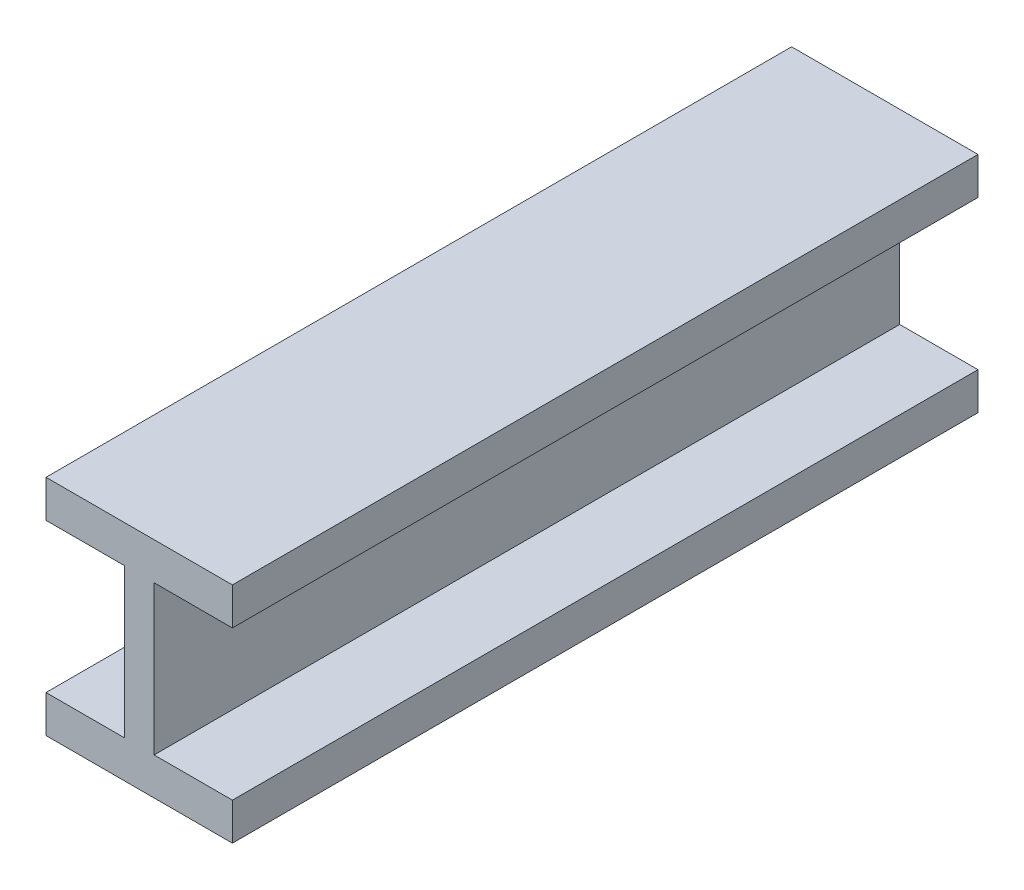
ISO-10303-21;
HEADER;
FILE_DESCRIPTION(('STEP AP214'),'2;1');
FILE_NAME('part.step','',(''),(''),'','','');
FILE_SCHEMA(('AUTOMOTIVE_DESIGN { 1 0 10303 214 1 1 1 1 }'));
ENDSEC;
DATA;
#1=APPLICATION_CONTEXT('core data for automotive mechanical design processes');
#2=APPLICATION_PROTOCOL_DEFINITION('international standard','automotive_design',2000,#1);
#3=PRODUCT_CONTEXT('',#1,'mechanical');
#4=PRODUCT('Part','Part','',(#3));
#5=PRODUCT_RELATED_PRODUCT_CATEGORY('part','',(#4));
#6=PRODUCT_DEFINITION_FORMATION('','',#4);
#7=PRODUCT_DEFINITION_CONTEXT('part definition',#1,'design');
#8=PRODUCT_DEFINITION('design','',#6,#7);
#9=PRODUCT_DEFINITION_SHAPE('','',#8);
#10=(LENGTH_UNIT() NAMED_UNIT(*) SI_UNIT(.MILLI.,.METRE.));
#11=(NAMED_UNIT(*) PLANE_ANGLE_UNIT() SI_UNIT($,.RADIAN.));
#12=(NAMED_UNIT(*) SI_UNIT($,.STERADIAN.) SOLID_ANGLE_UNIT());
#13=UNCERTAINTY_MEASURE_WITH_UNIT(LENGTH_MEASURE(1.E-05),#10,'distance_accuracy_value','');
#14=(GEOMETRIC_REPRESENTATION_CONTEXT(3) GLOBAL_UNCERTAINTY_ASSIGNED_CONTEXT((#13)) GLOBAL_UNIT_ASSIGNED_CONTEXT((#10,
#11,#12)) REPRESENTATION_CONTEXT('',''));
#15=CARTESIAN_POINT('',(0.,0.,0.));
#16=DIRECTION('',(0.,0.,1.));
#17=DIRECTION('',(1.,0.,0.));
#18=AXIS2_PLACEMENT_3D('',#15,#16,#17);
#19=CARTESIAN_POINT('',(-12.5,0.,-100.));
#20=DIRECTION('',(1.,0.,0.));
#21=DIRECTION('',(0.,0.,-1.));
#22=AXIS2_PLACEMENT_3D('',#19,#20,#21);
#23=PLANE('',#22);
#24=DIRECTION('',(0.,1.,0.));
#25=VECTOR('',#24,1.);
#26=CARTESIAN_POINT('',(-12.5,0.,0.));
#27=LINE('',#26,#25);
#28=CARTESIAN_POINT('',(-12.5,10.,0.));
#29=VERTEX_POINT('',#28);
#30=CARTESIAN_POINT('',(-12.5,15.,0.));
#31=VERTEX_POINT('',#30);
#32=EDGE_CURVE('E193',#29,#31,#27,.T.);
#33=ORIENTED_EDGE('',*,*,#32,.T.);
#34=DIRECTION('',(0.,0.,1.));
#35=VECTOR('',#34,1.);
#36=CARTESIAN_POINT('',(-12.5,15.,-100.));
#37=LINE('',#36,#35);
#38=CARTESIAN_POINT('',(-12.5,15.,-100.));
#39=VERTEX_POINT('',#38);
#40=EDGE_CURVE('E11',#39,#31,#37,.T.);
#41=ORIENTED_EDGE('',*,*,#40,.F.);
#42=DIRECTION('',(0.,1.,0.));
#43=VECTOR('',#42,1.);
#44=CARTESIAN_POINT('',(-12.5,0.,-100.));
#45=LINE('',#44,#43);
#46=CARTESIAN_POINT('',(-12.5,10.,-100.));
#47=VERTEX_POINT('',#46);
#48=EDGE_CURVE('E162',#47,#39,#45,.T.);
#49=ORIENTED_EDGE('',*,*,#48,.F.);
#50=DIRECTION('',(0.,0.,1.));
#51=VECTOR('',#50,1.);
#52=CARTESIAN_POINT('',(-12.5,10.,-100.));
#53=LINE('',#52,#51);
#54=EDGE_CURVE('E43',#47,#29,#53,.T.);
#55=ORIENTED_EDGE('',*,*,#54,.T.);
#56=EDGE_LOOP('',(#33,#41,#49,#55));
#57=FACE_BOUND('',#56,.T.);
#58=ADVANCED_FACE('F40',(#57),#23,.F.);
#59=CARTESIAN_POINT('',(0.,15.,-100.));
#60=DIRECTION('',(0.,-1.,0.));
#61=DIRECTION('',(1.,0.,0.));
#62=AXIS2_PLACEMENT_3D('',#59,#60,#61);
#63=PLANE('',#62);
#64=DIRECTION('',(1.,0.,0.));
#65=VECTOR('',#64,1.);
#66=CARTESIAN_POINT('',(0.,15.,0.));
#67=LINE('',#66,#65);
#68=CARTESIAN_POINT('',(12.5,15.,0.));
#69=VERTEX_POINT('',#68);
#70=EDGE_CURVE('E103',#31,#69,#67,.T.);
#71=ORIENTED_EDGE('',*,*,#70,.T.);
#72=DIRECTION('',(0.,0.,1.));
#73=VECTOR('',#72,1.);
#74=CARTESIAN_POINT('',(12.5,15.,-100.));
#75=LINE('',#74,#73);
#76=CARTESIAN_POINT('',(12.5,15.,-100.));
#77=VERTEX_POINT('',#76);
#78=EDGE_CURVE('E49',#77,#69,#75,.T.);
#79=ORIENTED_EDGE('',*,*,#78,.F.);
#80=DIRECTION('',(1.,0.,0.));
#81=VECTOR('',#80,1.);
#82=CARTESIAN_POINT('',(0.,15.,-100.));
#83=LINE('',#82,#81);
#84=EDGE_CURVE('E57',#39,#77,#83,.T.);
#85=ORIENTED_EDGE('',*,*,#84,.F.);
#86=ORIENTED_EDGE('',*,*,#40,.T.);
#87=EDGE_LOOP('',(#71,#79,#85,#86));
#88=FACE_BOUND('',#87,.T.);
#89=ADVANCED_FACE('F260',(#88),#63,.F.);
#90=CARTESIAN_POINT('',(12.5,0.,-100.));
#91=DIRECTION('',(1.,0.,0.));
#92=DIRECTION('',(0.,0.,-1.));
#93=AXIS2_PLACEMENT_3D('',#90,#91,#92);
#94=PLANE('',#93);
#95=DIRECTION('',(0.,1.,0.));
#96=VECTOR('',#95,1.);
#97=CARTESIAN_POINT('',(12.5,0.,0.));
#98=LINE('',#97,#96);
#99=CARTESIAN_POINT('',(12.5,10.,0.));
#100=VERTEX_POINT('',#99);
#101=EDGE_CURVE('E139',#100,#69,#98,.T.);
#102=ORIENTED_EDGE('',*,*,#101,.F.);
#103=DIRECTION('',(0.,0.,1.));
#104=VECTOR('',#103,1.);
#105=CARTESIAN_POINT('',(12.5,10.,-100.));
#106=LINE('',#105,#104);
#107=CARTESIAN_POINT('',(12.5,10.,-100.));
#108=VERTEX_POINT('',#107);
#109=EDGE_CURVE('E135',#108,#100,#106,.T.);
#110=ORIENTED_EDGE('',*,*,#109,.F.);
#111=DIRECTION('',(0.,1.,0.));
#112=VECTOR('',#111,1.);
#113=CARTESIAN_POINT('',(12.5,0.,-100.));
#114=LINE('',#113,#112);
#115=EDGE_CURVE('E138',#108,#77,#114,.T.);
#116=ORIENTED_EDGE('',*,*,#115,.T.);
#117=ORIENTED_EDGE('',*,*,#78,.T.);
#118=EDGE_LOOP('',(#102,#110,#116,#117));
#119=FACE_BOUND('',#118,.T.);
#120=ADVANCED_FACE('F137',(#119),#94,.T.);
#121=CARTESIAN_POINT('',(0.,10.,-100.));
#122=DIRECTION('',(0.,-1.,0.));
#123=DIRECTION('',(1.,0.,0.));
#124=AXIS2_PLACEMENT_3D('',#121,#122,#123);
#125=PLANE('',#124);
#126=DIRECTION('',(1.,0.,0.));
#127=VECTOR('',#126,1.);
#128=CARTESIAN_POINT('',(0.,10.,0.));
#129=LINE('',#128,#127);
#130=CARTESIAN_POINT('',(2.,10.,0.));
#131=VERTEX_POINT('',#130);
#132=EDGE_CURVE('E167',#131,#100,#129,.T.);
#133=ORIENTED_EDGE('',*,*,#132,.F.);
#134=DIRECTION('',(0.,0.,1.));
#135=VECTOR('',#134,1.);
#136=CARTESIAN_POINT('',(2.,10.,-100.));
#137=LINE('',#136,#135);
#138=CARTESIAN_POINT('',(2.,10.,-100.));
#139=VERTEX_POINT('',#138);
#140=EDGE_CURVE('E144',#139,#131,#137,.T.);
#141=ORIENTED_EDGE('',*,*,#140,.F.);
#142=DIRECTION('',(1.,0.,0.));
#143=VECTOR('',#142,1.);
#144=CARTESIAN_POINT('',(0.,10.,-100.));
#145=LINE('',#144,#143);
#146=EDGE_CURVE('E150',#139,#108,#145,.T.);
#147=ORIENTED_EDGE('',*,*,#146,.T.);
#148=ORIENTED_EDGE('',*,*,#109,.T.);
#149=EDGE_LOOP('',(#133,#141,#147,#148));
#150=FACE_BOUND('',#149,.T.);
#151=ADVANCED_FACE('F153',(#150),#125,.T.);
#152=CARTESIAN_POINT('',(2.,0.,-100.));
#153=DIRECTION('',(1.,0.,0.));
#154=DIRECTION('',(0.,0.,-1.));
#155=AXIS2_PLACEMENT_3D('',#152,#153,#154);
#156=PLANE('',#155);
#157=DIRECTION('',(0.,1.,0.));
#158=VECTOR('',#157,1.);
#159=CARTESIAN_POINT('',(2.,0.,0.));
#160=LINE('',#159,#158);
#161=CARTESIAN_POINT('',(2.,-9.99999999999999,0.));
#162=VERTEX_POINT('',#161);
#163=EDGE_CURVE('E210',#162,#131,#160,.T.);
#164=ORIENTED_EDGE('',*,*,#163,.F.);
#165=DIRECTION('',(0.,0.,1.));
#166=VECTOR('',#165,1.);
#167=CARTESIAN_POINT('',(2.,-9.99999999999999,-100.));
#168=LINE('',#167,#166);
#169=CARTESIAN_POINT('',(2.,-9.99999999999999,-100.));
#170=VERTEX_POINT('',#169);
#171=EDGE_CURVE('E173',#170,#162,#168,.T.);
#172=ORIENTED_EDGE('',*,*,#171,.F.);
#173=DIRECTION('',(0.,1.,0.));
#174=VECTOR('',#173,1.);
#175=CARTESIAN_POINT('',(2.,0.,-100.));
#176=LINE('',#175,#174);
#177=EDGE_CURVE('E154',#170,#139,#176,.T.);
#178=ORIENTED_EDGE('',*,*,#177,.T.);
#179=ORIENTED_EDGE('',*,*,#140,.T.);
#180=EDGE_LOOP('',(#164,#172,#178,#179));
#181=FACE_BOUND('',#180,.T.);
#182=ADVANCED_FACE('F258',(#181),#156,.T.);
#183=CARTESIAN_POINT('',(0.,-9.99999999999999,-100.));
#184=DIRECTION('',(0.,-1.,0.));
#185=DIRECTION('',(1.,0.,0.));
#186=AXIS2_PLACEMENT_3D('',#183,#184,#185);
#187=PLANE('',#186);
#188=DIRECTION('',(1.,0.,0.));
#189=VECTOR('',#188,1.);
#190=CARTESIAN_POINT('',(0.,-9.99999999999999,0.));
#191=LINE('',#190,#189);
#192=CARTESIAN_POINT('',(12.5,-9.99999999999999,0.));
#193=VERTEX_POINT('',#192);
#194=EDGE_CURVE('E203',#162,#193,#191,.T.);
#195=ORIENTED_EDGE('',*,*,#194,.T.);
#196=DIRECTION('',(0.,0.,1.));
#197=VECTOR('',#196,1.);
#198=CARTESIAN_POINT('',(12.5,-9.99999999999999,-100.));
#199=LINE('',#198,#197);
#200=CARTESIAN_POINT('',(12.5,-9.99999999999999,-100.));
#201=VERTEX_POINT('',#200);
#202=EDGE_CURVE('E175',#201,#193,#199,.T.);
#203=ORIENTED_EDGE('',*,*,#202,.F.);
#204=DIRECTION('',(1.,0.,0.));
#205=VECTOR('',#204,1.);
#206=CARTESIAN_POINT('',(0.,-9.99999999999999,-100.));
#207=LINE('',#206,#205);
#208=EDGE_CURVE('E157',#170,#201,#207,.T.);
#209=ORIENTED_EDGE('',*,*,#208,.F.);
#210=ORIENTED_EDGE('',*,*,#171,.T.);
#211=EDGE_LOOP('',(#195,#203,#209,#210));
#212=FACE_BOUND('',#211,.T.);
#213=ADVANCED_FACE('F217',(#212),#187,.F.);
#214=CARTESIAN_POINT('',(12.5,0.,-100.));
#215=DIRECTION('',(1.,0.,0.));
#216=DIRECTION('',(0.,0.,-1.));
#217=AXIS2_PLACEMENT_3D('',#214,#215,#216);
#218=PLANE('',#217);
#219=DIRECTION('',(0.,1.,0.));
#220=VECTOR('',#219,1.);
#221=CARTESIAN_POINT('',(12.5,0.,0.));
#222=LINE('',#221,#220);
#223=CARTESIAN_POINT('',(12.5,-15.,0.));
#224=VERTEX_POINT('',#223);
#225=EDGE_CURVE('E208',#224,#193,#222,.T.);
#226=ORIENTED_EDGE('',*,*,#225,.F.);
#227=DIRECTION('',(0.,0.,1.));
#228=VECTOR('',#227,1.);
#229=CARTESIAN_POINT('',(12.5,-15.,-100.));
#230=LINE('',#229,#228);
#231=CARTESIAN_POINT('',(12.5,-15.,-100.));
#232=VERTEX_POINT('',#231);
#233=EDGE_CURVE('E177',#232,#224,#230,.T.);
#234=ORIENTED_EDGE('',*,*,#233,.F.);
#235=DIRECTION('',(0.,1.,0.));
#236=VECTOR('',#235,1.);
#237=CARTESIAN_POINT('',(12.5,0.,-100.));
#238=LINE('',#237,#236);
#239=EDGE_CURVE('E227',#232,#201,#238,.T.);
#240=ORIENTED_EDGE('',*,*,#239,.T.);
#241=ORIENTED_EDGE('',*,*,#202,.T.);
#242=EDGE_LOOP('',(#226,#234,#240,#241));
#243=FACE_BOUND('',#242,.T.);
#244=ADVANCED_FACE('F225',(#243),#218,.T.);
#245=CARTESIAN_POINT('',(0.,-15.,-100.));
#246=DIRECTION('',(0.,-1.,0.));
#247=DIRECTION('',(0.,0.,-1.));
#248=AXIS2_PLACEMENT_3D('',#245,#246,#247);
#249=PLANE('',#248);
#250=DIRECTION('',(1.,0.,0.));
#251=VECTOR('',#250,1.);
#252=CARTESIAN_POINT('',(0.,-15.,0.));
#253=LINE('',#252,#251);
#254=CARTESIAN_POINT('',(-12.5,-15.,0.));
#255=VERTEX_POINT('',#254);
#256=EDGE_CURVE('E205',#255,#224,#253,.T.);
#257=ORIENTED_EDGE('',*,*,#256,.F.);
#258=DIRECTION('',(0.,0.,1.));
#259=VECTOR('',#258,1.);
#260=CARTESIAN_POINT('',(-12.5,-15.,-100.));
#261=LINE('',#260,#259);
#262=CARTESIAN_POINT('',(-12.5,-15.,-100.));
#263=VERTEX_POINT('',#262);
#264=EDGE_CURVE('E179',#263,#255,#261,.T.);
#265=ORIENTED_EDGE('',*,*,#264,.F.);
#266=DIRECTION('',(1.,0.,0.));
#267=VECTOR('',#266,1.);
#268=CARTESIAN_POINT('',(0.,-15.,-100.));
#269=LINE('',#268,#267);
#270=EDGE_CURVE('E230',#263,#232,#269,.T.);
#271=ORIENTED_EDGE('',*,*,#270,.T.);
#272=ORIENTED_EDGE('',*,*,#233,.T.);
#273=EDGE_LOOP('',(#257,#265,#271,#272));
#274=FACE_BOUND('',#273,.T.);
#275=ADVANCED_FACE('F307',(#274),#249,.T.);
#276=CARTESIAN_POINT('',(-12.5,0.,-100.));
#277=DIRECTION('',(1.,0.,0.));
#278=DIRECTION('',(0.,0.,-1.));
#279=AXIS2_PLACEMENT_3D('',#276,#277,#278);
#280=PLANE('',#279);
#281=DIRECTION('',(0.,1.,0.));
#282=VECTOR('',#281,1.);
#283=CARTESIAN_POINT('',(-12.5,0.,0.));
#284=LINE('',#283,#282);
#285=CARTESIAN_POINT('',(-12.5,-9.99999999999999,0.));
#286=VERTEX_POINT('',#285);
#287=EDGE_CURVE('E202',#255,#286,#284,.T.);
#288=ORIENTED_EDGE('',*,*,#287,.T.);
#289=DIRECTION('',(0.,0.,1.));
#290=VECTOR('',#289,1.);
#291=CARTESIAN_POINT('',(-12.5,-9.99999999999999,-100.));
#292=LINE('',#291,#290);
#293=CARTESIAN_POINT('',(-12.5,-9.99999999999999,-100.));
#294=VERTEX_POINT('',#293);
#295=EDGE_CURVE('E181',#294,#286,#292,.T.);
#296=ORIENTED_EDGE('',*,*,#295,.F.);
#297=DIRECTION('',(0.,1.,0.));
#298=VECTOR('',#297,1.);
#299=CARTESIAN_POINT('',(-12.5,0.,-100.));
#300=LINE('',#299,#298);
#301=EDGE_CURVE('E233',#263,#294,#300,.T.);
#302=ORIENTED_EDGE('',*,*,#301,.F.);
#303=ORIENTED_EDGE('',*,*,#264,.T.);
#304=EDGE_LOOP('',(#288,#296,#302,#303));
#305=FACE_BOUND('',#304,.T.);
#306=ADVANCED_FACE('F298',(#305),#280,.F.);
#307=CARTESIAN_POINT('',(-2.,-9.99999999999999,0.));
#308=VERTEX_POINT('',#307);
#309=EDGE_CURVE('E200',#286,#308,#191,.T.);
#310=ORIENTED_EDGE('',*,*,#309,.T.);
#311=DIRECTION('',(0.,0.,1.));
#312=VECTOR('',#311,1.);
#313=CARTESIAN_POINT('',(-2.,-9.99999999999999,-100.));
#314=LINE('',#313,#312);
#315=CARTESIAN_POINT('',(-2.,-9.99999999999999,-100.));
#316=VERTEX_POINT('',#315);
#317=EDGE_CURVE('E184',#316,#308,#314,.T.);
#318=ORIENTED_EDGE('',*,*,#317,.F.);
#319=EDGE_CURVE('E164',#294,#316,#207,.T.);
#320=ORIENTED_EDGE('',*,*,#319,.F.);
#321=ORIENTED_EDGE('',*,*,#295,.T.);
#322=EDGE_LOOP('',(#310,#318,#320,#321));
#323=FACE_BOUND('',#322,.T.);
#324=ADVANCED_FACE('F242',(#323),#187,.F.);
#325=CARTESIAN_POINT('',(-2.,0.,-100.));
#326=DIRECTION('',(1.,0.,0.));
#327=DIRECTION('',(0.,0.,-1.));
#328=AXIS2_PLACEMENT_3D('',#325,#326,#327);
#329=PLANE('',#328);
#330=DIRECTION('',(0.,1.,0.));
#331=VECTOR('',#330,1.);
#332=CARTESIAN_POINT('',(-2.,0.,0.));
#333=LINE('',#332,#331);
#334=CARTESIAN_POINT('',(-2.,10.,0.));
#335=VERTEX_POINT('',#334);
#336=EDGE_CURVE('E198',#308,#335,#333,.T.);
#337=ORIENTED_EDGE('',*,*,#336,.T.);
#338=DIRECTION('',(0.,0.,1.));
#339=VECTOR('',#338,1.);
#340=CARTESIAN_POINT('',(-2.,10.,-100.));
#341=LINE('',#340,#339);
#342=CARTESIAN_POINT('',(-2.,10.,-100.));
#343=VERTEX_POINT('',#342);
#344=EDGE_CURVE('E186',#343,#335,#341,.T.);
#345=ORIENTED_EDGE('',*,*,#344,.F.);
#346=DIRECTION('',(0.,1.,0.));
#347=VECTOR('',#346,1.);
#348=CARTESIAN_POINT('',(-2.,0.,-100.));
#349=LINE('',#348,#347);
#350=EDGE_CURVE('E161',#316,#343,#349,.T.);
#351=ORIENTED_EDGE('',*,*,#350,.F.);
#352=ORIENTED_EDGE('',*,*,#317,.T.);
#353=EDGE_LOOP('',(#337,#345,#351,#352));
#354=FACE_BOUND('',#353,.T.);
#355=ADVANCED_FACE('F246',(#354),#329,.F.);
#356=EDGE_CURVE('E195',#29,#335,#129,.T.);
#357=ORIENTED_EDGE('',*,*,#356,.F.);
#358=ORIENTED_EDGE('',*,*,#54,.F.);
#359=EDGE_CURVE('E156',#47,#343,#145,.T.);
#360=ORIENTED_EDGE('',*,*,#359,.T.);
#361=ORIENTED_EDGE('',*,*,#344,.T.);
#362=EDGE_LOOP('',(#357,#358,#360,#361));
#363=FACE_BOUND('',#362,.T.);
#364=ADVANCED_FACE('F247',(#363),#125,.T.);
#365=CARTESIAN_POINT('',(0.,0.,-100.));
#366=DIRECTION('',(0.,0.,1.));
#367=DIRECTION('',(1.,0.,0.));
#368=AXIS2_PLACEMENT_3D('',#365,#366,#367);
#369=PLANE('',#368);
#370=ORIENTED_EDGE('',*,*,#48,.T.);
#371=ORIENTED_EDGE('',*,*,#84,.T.);
#372=ORIENTED_EDGE('',*,*,#115,.F.);
#373=ORIENTED_EDGE('',*,*,#146,.F.);
#374=ORIENTED_EDGE('',*,*,#177,.F.);
#375=ORIENTED_EDGE('',*,*,#208,.T.);
#376=ORIENTED_EDGE('',*,*,#239,.F.);
#377=ORIENTED_EDGE('',*,*,#270,.F.);
#378=ORIENTED_EDGE('',*,*,#301,.T.);
#379=ORIENTED_EDGE('',*,*,#319,.T.);
#380=ORIENTED_EDGE('',*,*,#350,.T.);
#381=ORIENTED_EDGE('',*,*,#359,.F.);
#382=EDGE_LOOP('',(#370,#371,#372,#373,#374,#375,#376,#377,#378,#379,#380,#381));
#383=FACE_BOUND('',#382,.T.);
#384=ADVANCED_FACE('F148',(#383),#369,.F.);
#385=CARTESIAN_POINT('',(0.,0.,0.));
#386=DIRECTION('',(0.,0.,1.));
#387=DIRECTION('',(1.,0.,0.));
#388=AXIS2_PLACEMENT_3D('',#385,#386,#387);
#389=PLANE('',#388);
#390=ORIENTED_EDGE('',*,*,#32,.F.);
#391=ORIENTED_EDGE('',*,*,#356,.T.);
#392=ORIENTED_EDGE('',*,*,#336,.F.);
#393=ORIENTED_EDGE('',*,*,#309,.F.);
#394=ORIENTED_EDGE('',*,*,#287,.F.);
#395=ORIENTED_EDGE('',*,*,#256,.T.);
#396=ORIENTED_EDGE('',*,*,#225,.T.);
#397=ORIENTED_EDGE('',*,*,#194,.F.);
#398=ORIENTED_EDGE('',*,*,#163,.T.);
#399=ORIENTED_EDGE('',*,*,#132,.T.);
#400=ORIENTED_EDGE('',*,*,#101,.T.);
#401=ORIENTED_EDGE('',*,*,#70,.F.);
#402=EDGE_LOOP('',(#390,#391,#392,#393,#394,#395,#396,#397,#398,#399,#400,#401));
#403=FACE_BOUND('',#402,.T.);
#404=ADVANCED_FACE('F221',(#403),#389,.T.);
#405=CLOSED_SHELL('',(#58,#89,#120,#151,#182,#213,#244,#275,#306,#324,#355,#364,#384,#404));
#406=MANIFOLD_SOLID_BREP('B2',#405);
#407=ADVANCED_BREP_SHAPE_REPRESENTATION('',(#18,#406),#14);
#408=SHAPE_DEFINITION_REPRESENTATION(#9,#407);
ENDSEC;
END-ISO-10303-21;
